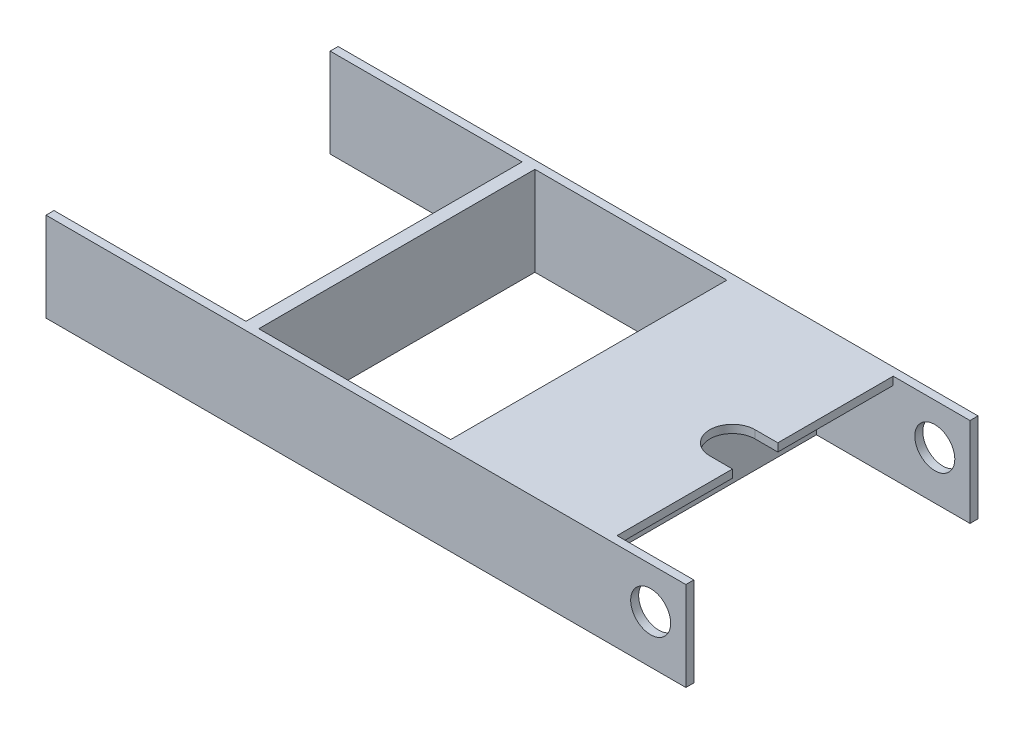
ISO-10303-21;
HEADER;
FILE_DESCRIPTION(('STEP AP214'),'2;1');
FILE_NAME('part.step','',(''),(''),'','','');
FILE_SCHEMA(('AUTOMOTIVE_DESIGN { 1 0 10303 214 1 1 1 1 }'));
ENDSEC;
DATA;
#1=APPLICATION_CONTEXT('core data for automotive mechanical design processes');
#2=APPLICATION_PROTOCOL_DEFINITION('international standard','automotive_design',2000,#1);
#3=PRODUCT_CONTEXT('',#1,'mechanical');
#4=PRODUCT('Part','Part','',(#3));
#5=PRODUCT_RELATED_PRODUCT_CATEGORY('part','',(#4));
#6=PRODUCT_DEFINITION_FORMATION('','',#4);
#7=PRODUCT_DEFINITION_CONTEXT('part definition',#1,'design');
#8=PRODUCT_DEFINITION('design','',#6,#7);
#9=PRODUCT_DEFINITION_SHAPE('','',#8);
#10=(LENGTH_UNIT() NAMED_UNIT(*) SI_UNIT(.MILLI.,.METRE.));
#11=(NAMED_UNIT(*) PLANE_ANGLE_UNIT() SI_UNIT($,.RADIAN.));
#12=(NAMED_UNIT(*) SI_UNIT($,.STERADIAN.) SOLID_ANGLE_UNIT());
#13=UNCERTAINTY_MEASURE_WITH_UNIT(LENGTH_MEASURE(1.E-05),#10,'distance_accuracy_value','');
#14=(GEOMETRIC_REPRESENTATION_CONTEXT(3) GLOBAL_UNCERTAINTY_ASSIGNED_CONTEXT((#13)) GLOBAL_UNIT_ASSIGNED_CONTEXT((#10,
#11,#12)) REPRESENTATION_CONTEXT('',''));
#15=CARTESIAN_POINT('',(0.,0.,0.));
#16=DIRECTION('',(0.,0.,1.));
#17=DIRECTION('',(1.,0.,0.));
#18=AXIS2_PLACEMENT_3D('',#15,#16,#17);
#19=CARTESIAN_POINT('',(0.,17.70126,0.));
#20=DIRECTION('',(0.,-1.,0.));
#21=DIRECTION('',(0.,0.,-1.));
#22=AXIS2_PLACEMENT_3D('',#19,#20,#21);
#23=PLANE('',#22);
#24=DIRECTION('',(-1.,0.,0.));
#25=VECTOR('',#24,1.);
#26=CARTESIAN_POINT('',(0.,17.70126,27.4066));
#27=LINE('',#26,#25);
#28=CARTESIAN_POINT('',(-25.4,17.70126,27.4066));
#29=VERTEX_POINT('',#28);
#30=CARTESIAN_POINT('',(-63.5,17.70126,27.4066));
#31=VERTEX_POINT('',#30);
#32=EDGE_CURVE('E225',#29,#31,#27,.T.);
#33=ORIENTED_EDGE('',*,*,#32,.T.);
#34=DIRECTION('',(0.,0.,1.));
#35=VECTOR('',#34,1.);
#36=CARTESIAN_POINT('',(-63.5,17.70126,-28.9941));
#37=LINE('',#36,#35);
#38=CARTESIAN_POINT('',(-63.5,17.70126,28.9941));
#39=VERTEX_POINT('',#38);
#40=EDGE_CURVE('E322',#31,#39,#37,.T.);
#41=ORIENTED_EDGE('',*,*,#40,.T.);
#42=DIRECTION('',(1.,0.,0.));
#43=VECTOR('',#42,1.);
#44=CARTESIAN_POINT('',(63.5,17.70126,28.9941));
#45=LINE('',#44,#43);
#46=CARTESIAN_POINT('',(63.5,17.70126,28.9941));
#47=VERTEX_POINT('',#46);
#48=EDGE_CURVE('E321',#39,#47,#45,.T.);
#49=ORIENTED_EDGE('',*,*,#48,.T.);
#50=DIRECTION('',(0.,0.,-1.));
#51=VECTOR('',#50,1.);
#52=CARTESIAN_POINT('',(63.5,17.70126,-28.9941));
#53=LINE('',#52,#51);
#54=CARTESIAN_POINT('',(63.5,17.70126,27.4066));
#55=VERTEX_POINT('',#54);
#56=EDGE_CURVE('E325',#47,#55,#53,.T.);
#57=ORIENTED_EDGE('',*,*,#56,.T.);
#58=DIRECTION('',(1.,0.,0.));
#59=VECTOR('',#58,1.);
#60=CARTESIAN_POINT('',(0.,17.70126,27.4066));
#61=LINE('',#60,#59);
#62=CARTESIAN_POINT('',(48.26,17.70126,27.4066));
#63=VERTEX_POINT('',#62);
#64=EDGE_CURVE('E304',#63,#55,#61,.T.);
#65=ORIENTED_EDGE('',*,*,#64,.F.);
#66=DIRECTION('',(0.,0.,1.));
#67=VECTOR('',#66,1.);
#68=CARTESIAN_POINT('',(48.26,17.70126,0.));
#69=LINE('',#68,#67);
#70=CARTESIAN_POINT('',(48.26,17.70126,4.500000017));
#71=VERTEX_POINT('',#70);
#72=EDGE_CURVE('E293',#71,#63,#69,.T.);
#73=ORIENTED_EDGE('',*,*,#72,.F.);
#74=DIRECTION('',(1.,0.,0.));
#75=VECTOR('',#74,1.);
#76=CARTESIAN_POINT('',(0.,17.70126,4.50000001699999));
#77=LINE('',#76,#75);
#78=CARTESIAN_POINT('',(43.759999983,17.70126,4.500000017));
#79=VERTEX_POINT('',#78);
#80=EDGE_CURVE('E249',#79,#71,#77,.T.);
#81=ORIENTED_EDGE('',*,*,#80,.F.);
#82=CARTESIAN_POINT('',(43.759999983,17.70126,0.));
#83=DIRECTION('',(0.,1.,0.));
#84=DIRECTION('',(0.,0.,1.));
#85=AXIS2_PLACEMENT_3D('',#82,#83,#84);
#86=CIRCLE('',#85,4.500000017);
#87=CARTESIAN_POINT('',(43.759999983,17.70126,-4.500000017));
#88=VERTEX_POINT('',#87);
#89=EDGE_CURVE('E240',#88,#79,#86,.T.);
#90=ORIENTED_EDGE('',*,*,#89,.F.);
#91=DIRECTION('',(1.,0.,0.));
#92=VECTOR('',#91,1.);
#93=CARTESIAN_POINT('',(0.,17.70126,-4.50000001699999));
#94=LINE('',#93,#92);
#95=CARTESIAN_POINT('',(48.26,17.70126,-4.500000017));
#96=VERTEX_POINT('',#95);
#97=EDGE_CURVE('E251',#88,#96,#94,.T.);
#98=ORIENTED_EDGE('',*,*,#97,.T.);
#99=CARTESIAN_POINT('',(48.26,17.70126,-27.4066));
#100=VERTEX_POINT('',#99);
#101=EDGE_CURVE('E301',#100,#96,#69,.T.);
#102=ORIENTED_EDGE('',*,*,#101,.F.);
#103=DIRECTION('',(1.,0.,0.));
#104=VECTOR('',#103,1.);
#105=CARTESIAN_POINT('',(0.,17.70126,-27.4066));
#106=LINE('',#105,#104);
#107=CARTESIAN_POINT('',(63.5,17.70126,-27.4066));
#108=VERTEX_POINT('',#107);
#109=EDGE_CURVE('E298',#100,#108,#106,.T.);
#110=ORIENTED_EDGE('',*,*,#109,.T.);
#111=CARTESIAN_POINT('',(63.5,17.70126,-28.9941));
#112=VERTEX_POINT('',#111);
#113=EDGE_CURVE('E324',#108,#112,#53,.T.);
#114=ORIENTED_EDGE('',*,*,#113,.T.);
#115=DIRECTION('',(-1.,0.,0.));
#116=VECTOR('',#115,1.);
#117=CARTESIAN_POINT('',(63.5,17.70126,-28.9941));
#118=LINE('',#117,#116);
#119=CARTESIAN_POINT('',(-63.5,17.70126,-28.9941));
#120=VERTEX_POINT('',#119);
#121=EDGE_CURVE('E328',#112,#120,#118,.T.);
#122=ORIENTED_EDGE('',*,*,#121,.T.);
#123=CARTESIAN_POINT('',(-63.5,17.70126,-27.4066));
#124=VERTEX_POINT('',#123);
#125=EDGE_CURVE('E318',#120,#124,#37,.T.);
#126=ORIENTED_EDGE('',*,*,#125,.T.);
#127=DIRECTION('',(-1.,0.,0.));
#128=VECTOR('',#127,1.);
#129=CARTESIAN_POINT('',(0.,17.70126,-27.4066));
#130=LINE('',#129,#128);
#131=CARTESIAN_POINT('',(-25.4,17.70126,-27.4066));
#132=VERTEX_POINT('',#131);
#133=EDGE_CURVE('E233',#132,#124,#130,.T.);
#134=ORIENTED_EDGE('',*,*,#133,.F.);
#135=DIRECTION('',(0.,0.,1.));
#136=VECTOR('',#135,1.);
#137=CARTESIAN_POINT('',(-25.4,17.70126,0.));
#138=LINE('',#137,#136);
#139=EDGE_CURVE('E218',#132,#29,#138,.T.);
#140=ORIENTED_EDGE('',*,*,#139,.T.);
#141=EDGE_LOOP('',(#33,#41,#49,#57,#65,#73,#81,#90,#98,#102,#110,#114,#122,#126,#134,#140));
#142=FACE_BOUND('',#141,.T.);
#143=DIRECTION('',(0.,0.,1.));
#144=VECTOR('',#143,1.);
#145=CARTESIAN_POINT('',(15.24,17.70126,0.));
#146=LINE('',#145,#144);
#147=CARTESIAN_POINT('',(15.24,17.70126,-27.4066));
#148=VERTEX_POINT('',#147);
#149=CARTESIAN_POINT('',(15.24,17.70126,27.4066));
#150=VERTEX_POINT('',#149);
#151=EDGE_CURVE('E53',#148,#150,#146,.T.);
#152=ORIENTED_EDGE('',*,*,#151,.T.);
#153=DIRECTION('',(1.,0.,0.));
#154=VECTOR('',#153,1.);
#155=CARTESIAN_POINT('',(0.,17.70126,27.4066));
#156=LINE('',#155,#154);
#157=CARTESIAN_POINT('',(-22.86,17.70126,27.4066));
#158=VERTEX_POINT('',#157);
#159=EDGE_CURVE('E203',#158,#150,#156,.T.);
#160=ORIENTED_EDGE('',*,*,#159,.F.);
#161=DIRECTION('',(0.,0.,1.));
#162=VECTOR('',#161,1.);
#163=CARTESIAN_POINT('',(-22.86,17.70126,0.));
#164=LINE('',#163,#162);
#165=CARTESIAN_POINT('',(-22.86,17.70126,-27.4066));
#166=VERTEX_POINT('',#165);
#167=EDGE_CURVE('E206',#166,#158,#164,.T.);
#168=ORIENTED_EDGE('',*,*,#167,.F.);
#169=DIRECTION('',(1.,0.,0.));
#170=VECTOR('',#169,1.);
#171=CARTESIAN_POINT('',(0.,17.70126,-27.4066));
#172=LINE('',#171,#170);
#173=EDGE_CURVE('E212',#166,#148,#172,.T.);
#174=ORIENTED_EDGE('',*,*,#173,.T.);
#175=EDGE_LOOP('',(#152,#160,#168,#174));
#176=FACE_BOUND('',#175,.T.);
#177=ADVANCED_FACE('F38',(#142,#176),#23,.F.);
#178=CARTESIAN_POINT('',(0.,0.,0.));
#179=DIRECTION('',(0.,-1.,0.));
#180=DIRECTION('',(0.,0.,-1.));
#181=AXIS2_PLACEMENT_3D('',#178,#179,#180);
#182=PLANE('',#181);
#183=DIRECTION('',(0.,0.,1.));
#184=VECTOR('',#183,1.);
#185=CARTESIAN_POINT('',(-63.5,0.,-28.9941));
#186=LINE('',#185,#184);
#187=CARTESIAN_POINT('',(-63.5,0.,27.4066));
#188=VERTEX_POINT('',#187);
#189=CARTESIAN_POINT('',(-63.5,0.,28.9941));
#190=VERTEX_POINT('',#189);
#191=EDGE_CURVE('E311',#188,#190,#186,.T.);
#192=ORIENTED_EDGE('',*,*,#191,.F.);
#193=DIRECTION('',(-1.,0.,0.));
#194=VECTOR('',#193,1.);
#195=CARTESIAN_POINT('',(0.,0.,27.4066));
#196=LINE('',#195,#194);
#197=CARTESIAN_POINT('',(-25.4,0.,27.4066));
#198=VERTEX_POINT('',#197);
#199=EDGE_CURVE('E228',#198,#188,#196,.T.);
#200=ORIENTED_EDGE('',*,*,#199,.F.);
#201=DIRECTION('',(0.,0.,1.));
#202=VECTOR('',#201,1.);
#203=CARTESIAN_POINT('',(-25.4,0.,0.));
#204=LINE('',#203,#202);
#205=CARTESIAN_POINT('',(-25.4,0.,-27.4066));
#206=VERTEX_POINT('',#205);
#207=EDGE_CURVE('E222',#206,#198,#204,.T.);
#208=ORIENTED_EDGE('',*,*,#207,.F.);
#209=DIRECTION('',(-1.,0.,0.));
#210=VECTOR('',#209,1.);
#211=CARTESIAN_POINT('',(0.,0.,-27.4066));
#212=LINE('',#211,#210);
#213=CARTESIAN_POINT('',(-63.5,0.,-27.4066));
#214=VERTEX_POINT('',#213);
#215=EDGE_CURVE('E224',#206,#214,#212,.T.);
#216=ORIENTED_EDGE('',*,*,#215,.T.);
#217=CARTESIAN_POINT('',(-63.5,0.,-28.9941));
#218=VERTEX_POINT('',#217);
#219=EDGE_CURVE('E331',#218,#214,#186,.T.);
#220=ORIENTED_EDGE('',*,*,#219,.F.);
#221=DIRECTION('',(-1.,0.,0.));
#222=VECTOR('',#221,1.);
#223=CARTESIAN_POINT('',(63.5,0.,-28.9941));
#224=LINE('',#223,#222);
#225=CARTESIAN_POINT('',(63.5,0.,-28.9941));
#226=VERTEX_POINT('',#225);
#227=EDGE_CURVE('E340',#226,#218,#224,.T.);
#228=ORIENTED_EDGE('',*,*,#227,.F.);
#229=DIRECTION('',(0.,0.,-1.));
#230=VECTOR('',#229,1.);
#231=CARTESIAN_POINT('',(63.5,0.,-28.9941));
#232=LINE('',#231,#230);
#233=CARTESIAN_POINT('',(63.5,0.,-27.4066));
#234=VERTEX_POINT('',#233);
#235=EDGE_CURVE('E336',#234,#226,#232,.T.);
#236=ORIENTED_EDGE('',*,*,#235,.F.);
#237=DIRECTION('',(1.,0.,0.));
#238=VECTOR('',#237,1.);
#239=CARTESIAN_POINT('',(0.,0.,-27.4066));
#240=LINE('',#239,#238);
#241=CARTESIAN_POINT('',(33.02,0.,-27.4066));
#242=VERTEX_POINT('',#241);
#243=EDGE_CURVE('E297',#242,#234,#240,.T.);
#244=ORIENTED_EDGE('',*,*,#243,.F.);
#245=DIRECTION('',(0.,0.,-1.));
#246=VECTOR('',#245,1.);
#247=CARTESIAN_POINT('',(33.02,0.,0.));
#248=LINE('',#247,#246);
#249=CARTESIAN_POINT('',(33.02,0.,27.4066));
#250=VERTEX_POINT('',#249);
#251=EDGE_CURVE('E269',#250,#242,#248,.T.);
#252=ORIENTED_EDGE('',*,*,#251,.F.);
#253=DIRECTION('',(1.,0.,0.));
#254=VECTOR('',#253,1.);
#255=CARTESIAN_POINT('',(0.,0.,27.4066));
#256=LINE('',#255,#254);
#257=CARTESIAN_POINT('',(63.5,0.,27.4066));
#258=VERTEX_POINT('',#257);
#259=EDGE_CURVE('E294',#250,#258,#256,.T.);
#260=ORIENTED_EDGE('',*,*,#259,.T.);
#261=CARTESIAN_POINT('',(63.5,0.,28.9941));
#262=VERTEX_POINT('',#261);
#263=EDGE_CURVE('E337',#262,#258,#232,.T.);
#264=ORIENTED_EDGE('',*,*,#263,.F.);
#265=DIRECTION('',(1.,0.,0.));
#266=VECTOR('',#265,1.);
#267=CARTESIAN_POINT('',(63.5,0.,28.9941));
#268=LINE('',#267,#266);
#269=EDGE_CURVE('E334',#190,#262,#268,.T.);
#270=ORIENTED_EDGE('',*,*,#269,.F.);
#271=EDGE_LOOP('',(#192,#200,#208,#216,#220,#228,#236,#244,#252,#260,#264,#270));
#272=FACE_BOUND('',#271,.T.);
#273=DIRECTION('',(1.,0.,0.));
#274=VECTOR('',#273,1.);
#275=CARTESIAN_POINT('',(0.,0.,27.4066));
#276=LINE('',#275,#274);
#277=CARTESIAN_POINT('',(-22.86,0.,27.4066));
#278=VERTEX_POINT('',#277);
#279=CARTESIAN_POINT('',(15.24,0.,27.4066));
#280=VERTEX_POINT('',#279);
#281=EDGE_CURVE('E198',#278,#280,#276,.T.);
#282=ORIENTED_EDGE('',*,*,#281,.T.);
#283=DIRECTION('',(0.,0.,1.));
#284=VECTOR('',#283,1.);
#285=CARTESIAN_POINT('',(15.24,0.,0.));
#286=LINE('',#285,#284);
#287=CARTESIAN_POINT('',(15.24,0.,-27.4066));
#288=VERTEX_POINT('',#287);
#289=EDGE_CURVE('E194',#288,#280,#286,.T.);
#290=ORIENTED_EDGE('',*,*,#289,.F.);
#291=DIRECTION('',(1.,0.,0.));
#292=VECTOR('',#291,1.);
#293=CARTESIAN_POINT('',(0.,0.,-27.4066));
#294=LINE('',#293,#292);
#295=CARTESIAN_POINT('',(-22.86,0.,-27.4066));
#296=VERTEX_POINT('',#295);
#297=EDGE_CURVE('E186',#296,#288,#294,.T.);
#298=ORIENTED_EDGE('',*,*,#297,.F.);
#299=DIRECTION('',(0.,0.,1.));
#300=VECTOR('',#299,1.);
#301=CARTESIAN_POINT('',(-22.86,0.,0.));
#302=LINE('',#301,#300);
#303=EDGE_CURVE('E61',#296,#278,#302,.T.);
#304=ORIENTED_EDGE('',*,*,#303,.T.);
#305=EDGE_LOOP('',(#282,#290,#298,#304));
#306=FACE_BOUND('',#305,.T.);
#307=ADVANCED_FACE('F201',(#272,#306),#182,.T.);
#308=CARTESIAN_POINT('',(-63.5,17.70126,-28.9941));
#309=DIRECTION('',(1.,0.,0.));
#310=DIRECTION('',(0.,0.,-1.));
#311=AXIS2_PLACEMENT_3D('',#308,#309,#310);
#312=PLANE('',#311);
#313=DIRECTION('',(0.,1.,0.));
#314=VECTOR('',#313,1.);
#315=CARTESIAN_POINT('',(-63.5,0.,27.4066));
#316=LINE('',#315,#314);
#317=EDGE_CURVE('E241',#188,#31,#316,.T.);
#318=ORIENTED_EDGE('',*,*,#317,.F.);
#319=ORIENTED_EDGE('',*,*,#191,.T.);
#320=DIRECTION('',(0.,-1.,0.));
#321=VECTOR('',#320,1.);
#322=CARTESIAN_POINT('',(-63.5,17.70126,28.9941));
#323=LINE('',#322,#321);
#324=EDGE_CURVE('E350',#39,#190,#323,.T.);
#325=ORIENTED_EDGE('',*,*,#324,.F.);
#326=ORIENTED_EDGE('',*,*,#40,.F.);
#327=EDGE_LOOP('',(#318,#319,#325,#326));
#328=FACE_BOUND('',#327,.T.);
#329=ADVANCED_FACE('F413',(#328),#312,.F.);
#330=CARTESIAN_POINT('',(48.26,0.,0.));
#331=DIRECTION('',(-1.,0.,0.));
#332=DIRECTION('',(0.,0.,1.));
#333=AXIS2_PLACEMENT_3D('',#330,#331,#332);
#334=PLANE('',#333);
#335=DIRECTION('',(0.,1.,0.));
#336=VECTOR('',#335,1.);
#337=CARTESIAN_POINT('',(48.26,0.,-4.500000017));
#338=LINE('',#337,#336);
#339=CARTESIAN_POINT('',(48.26,16.11376,-4.500000017));
#340=VERTEX_POINT('',#339);
#341=EDGE_CURVE('E258',#340,#96,#338,.T.);
#342=ORIENTED_EDGE('',*,*,#341,.F.);
#343=DIRECTION('',(0.,0.,-1.));
#344=VECTOR('',#343,1.);
#345=CARTESIAN_POINT('',(48.26,16.11376,0.));
#346=LINE('',#345,#344);
#347=CARTESIAN_POINT('',(48.26,16.11376,-27.4066));
#348=VERTEX_POINT('',#347);
#349=EDGE_CURVE('E279',#340,#348,#346,.T.);
#350=ORIENTED_EDGE('',*,*,#349,.T.);
#351=DIRECTION('',(0.,1.,0.));
#352=VECTOR('',#351,1.);
#353=CARTESIAN_POINT('',(48.26,0.,-27.4066));
#354=LINE('',#353,#352);
#355=EDGE_CURVE('E309',#348,#100,#354,.T.);
#356=ORIENTED_EDGE('',*,*,#355,.T.);
#357=ORIENTED_EDGE('',*,*,#101,.T.);
#358=EDGE_LOOP('',(#342,#350,#356,#357));
#359=FACE_BOUND('',#358,.T.);
#360=ADVANCED_FACE('F411',(#359),#334,.F.);
#361=CARTESIAN_POINT('',(63.5,16.11376,0.));
#362=DIRECTION('',(0.,1.,0.));
#363=DIRECTION('',(0.,0.,1.));
#364=AXIS2_PLACEMENT_3D('',#361,#362,#363);
#365=PLANE('',#364);
#366=DIRECTION('',(1.,0.,0.));
#367=VECTOR('',#366,1.);
#368=CARTESIAN_POINT('',(63.5,16.11376,-4.500000017));
#369=LINE('',#368,#367);
#370=CARTESIAN_POINT('',(43.759999983,16.11376,-4.500000017));
#371=VERTEX_POINT('',#370);
#372=EDGE_CURVE('E11',#371,#340,#369,.T.);
#373=ORIENTED_EDGE('',*,*,#372,.F.);
#374=CARTESIAN_POINT('',(43.759999983,16.11376,0.));
#375=DIRECTION('',(0.,1.,0.));
#376=DIRECTION('',(0.,0.,1.));
#377=AXIS2_PLACEMENT_3D('',#374,#375,#376);
#378=CIRCLE('',#377,4.500000017);
#379=CARTESIAN_POINT('',(43.759999983,16.11376,4.500000017));
#380=VERTEX_POINT('',#379);
#381=EDGE_CURVE('E46',#371,#380,#378,.T.);
#382=ORIENTED_EDGE('',*,*,#381,.T.);
#383=DIRECTION('',(1.,0.,0.));
#384=VECTOR('',#383,1.);
#385=CARTESIAN_POINT('',(63.5,16.11376,4.500000017));
#386=LINE('',#385,#384);
#387=CARTESIAN_POINT('',(48.26,16.11376,4.500000017));
#388=VERTEX_POINT('',#387);
#389=EDGE_CURVE('E353',#380,#388,#386,.T.);
#390=ORIENTED_EDGE('',*,*,#389,.T.);
#391=CARTESIAN_POINT('',(48.26,16.11376,27.4066));
#392=VERTEX_POINT('',#391);
#393=EDGE_CURVE('E280',#392,#388,#346,.T.);
#394=ORIENTED_EDGE('',*,*,#393,.F.);
#395=DIRECTION('',(-1.,0.,0.));
#396=VECTOR('',#395,1.);
#397=CARTESIAN_POINT('',(63.5,16.11376,27.4066));
#398=LINE('',#397,#396);
#399=CARTESIAN_POINT('',(33.02,16.11376,27.4066));
#400=VERTEX_POINT('',#399);
#401=EDGE_CURVE('E277',#392,#400,#398,.T.);
#402=ORIENTED_EDGE('',*,*,#401,.T.);
#403=DIRECTION('',(0.,0.,-1.));
#404=VECTOR('',#403,1.);
#405=CARTESIAN_POINT('',(33.02,16.11376,0.));
#406=LINE('',#405,#404);
#407=CARTESIAN_POINT('',(33.02,16.11376,-27.4066));
#408=VERTEX_POINT('',#407);
#409=EDGE_CURVE('E257',#400,#408,#406,.T.);
#410=ORIENTED_EDGE('',*,*,#409,.T.);
#411=DIRECTION('',(-1.,0.,0.));
#412=VECTOR('',#411,1.);
#413=CARTESIAN_POINT('',(63.5,16.11376,-27.4066));
#414=LINE('',#413,#412);
#415=EDGE_CURVE('E275',#348,#408,#414,.T.);
#416=ORIENTED_EDGE('',*,*,#415,.F.);
#417=ORIENTED_EDGE('',*,*,#349,.F.);
#418=EDGE_LOOP('',(#373,#382,#390,#394,#402,#410,#416,#417));
#419=FACE_BOUND('',#418,.T.);
#420=ADVANCED_FACE('F360',(#419),#365,.F.);
#421=CARTESIAN_POINT('',(63.5,17.70126,-28.9941));
#422=DIRECTION('',(-1.,0.,0.));
#423=DIRECTION('',(0.,0.,1.));
#424=AXIS2_PLACEMENT_3D('',#421,#422,#423);
#425=PLANE('',#424);
#426=DIRECTION('',(0.,1.,0.));
#427=VECTOR('',#426,1.);
#428=CARTESIAN_POINT('',(63.5,0.,-27.4066));
#429=LINE('',#428,#427);
#430=EDGE_CURVE('E312',#234,#108,#429,.T.);
#431=ORIENTED_EDGE('',*,*,#430,.F.);
#432=ORIENTED_EDGE('',*,*,#235,.T.);
#433=DIRECTION('',(0.,-1.,0.));
#434=VECTOR('',#433,1.);
#435=CARTESIAN_POINT('',(63.5,17.70126,-28.9941));
#436=LINE('',#435,#434);
#437=EDGE_CURVE('E344',#112,#226,#436,.T.);
#438=ORIENTED_EDGE('',*,*,#437,.F.);
#439=ORIENTED_EDGE('',*,*,#113,.F.);
#440=EDGE_LOOP('',(#431,#432,#438,#439));
#441=FACE_BOUND('',#440,.T.);
#442=ADVANCED_FACE('F405',(#441),#425,.F.);
#443=ORIENTED_EDGE('',*,*,#219,.T.);
#444=DIRECTION('',(0.,1.,0.));
#445=VECTOR('',#444,1.);
#446=CARTESIAN_POINT('',(-63.5,0.,-27.4066));
#447=LINE('',#446,#445);
#448=EDGE_CURVE('E243',#214,#124,#447,.T.);
#449=ORIENTED_EDGE('',*,*,#448,.T.);
#450=ORIENTED_EDGE('',*,*,#125,.F.);
#451=DIRECTION('',(0.,-1.,0.));
#452=VECTOR('',#451,1.);
#453=CARTESIAN_POINT('',(-63.5,17.70126,-28.9941));
#454=LINE('',#453,#452);
#455=EDGE_CURVE('E330',#120,#218,#454,.T.);
#456=ORIENTED_EDGE('',*,*,#455,.T.);
#457=EDGE_LOOP('',(#443,#449,#450,#456));
#458=FACE_BOUND('',#457,.T.);
#459=ADVANCED_FACE('F40',(#458),#312,.F.);
#460=CARTESIAN_POINT('',(63.5,17.70126,28.9941));
#461=DIRECTION('',(0.,0.,-1.));
#462=DIRECTION('',(-1.,0.,0.));
#463=AXIS2_PLACEMENT_3D('',#460,#461,#462);
#464=PLANE('',#463);
#465=CARTESIAN_POINT('',(56.515,9.54786,28.9941));
#466=DIRECTION('',(0.,0.,1.));
#467=DIRECTION('',(1.,0.,0.));
#468=AXIS2_PLACEMENT_3D('',#465,#466,#467);
#469=CIRCLE('',#468,3.96875);
#470=CARTESIAN_POINT('',(60.48375,9.54786,28.9941));
#471=VERTEX_POINT('',#470);
#472=EDGE_CURVE('E283',#471,#471,#469,.T.);
#473=ORIENTED_EDGE('',*,*,#472,.F.);
#474=EDGE_LOOP('',(#473));
#475=FACE_BOUND('',#474,.T.);
#476=ORIENTED_EDGE('',*,*,#269,.T.);
#477=DIRECTION('',(0.,-1.,0.));
#478=VECTOR('',#477,1.);
#479=CARTESIAN_POINT('',(63.5,17.70126,28.9941));
#480=LINE('',#479,#478);
#481=EDGE_CURVE('E347',#47,#262,#480,.T.);
#482=ORIENTED_EDGE('',*,*,#481,.F.);
#483=ORIENTED_EDGE('',*,*,#48,.F.);
#484=ORIENTED_EDGE('',*,*,#324,.T.);
#485=EDGE_LOOP('',(#476,#482,#483,#484));
#486=FACE_BOUND('',#485,.T.);
#487=ADVANCED_FACE('F437',(#475,#486),#464,.F.);
#488=ORIENTED_EDGE('',*,*,#263,.T.);
#489=DIRECTION('',(0.,1.,0.));
#490=VECTOR('',#489,1.);
#491=CARTESIAN_POINT('',(63.5,0.,27.4066));
#492=LINE('',#491,#490);
#493=EDGE_CURVE('E314',#258,#55,#492,.T.);
#494=ORIENTED_EDGE('',*,*,#493,.T.);
#495=ORIENTED_EDGE('',*,*,#56,.F.);
#496=ORIENTED_EDGE('',*,*,#481,.T.);
#497=EDGE_LOOP('',(#488,#494,#495,#496));
#498=FACE_BOUND('',#497,.T.);
#499=ADVANCED_FACE('F434',(#498),#425,.F.);
#500=CARTESIAN_POINT('',(63.5,17.70126,-28.9941));
#501=DIRECTION('',(0.,0.,1.));
#502=DIRECTION('',(1.,0.,0.));
#503=AXIS2_PLACEMENT_3D('',#500,#501,#502);
#504=PLANE('',#503);
#505=CARTESIAN_POINT('',(56.515,9.54786,-28.9941));
#506=DIRECTION('',(0.,0.,1.));
#507=DIRECTION('',(1.,0.,0.));
#508=AXIS2_PLACEMENT_3D('',#505,#506,#507);
#509=CIRCLE('',#508,3.96875);
#510=CARTESIAN_POINT('',(60.48375,9.54786,-28.9941));
#511=VERTEX_POINT('',#510);
#512=EDGE_CURVE('E286',#511,#511,#509,.T.);
#513=ORIENTED_EDGE('',*,*,#512,.T.);
#514=EDGE_LOOP('',(#513));
#515=FACE_BOUND('',#514,.T.);
#516=ORIENTED_EDGE('',*,*,#227,.T.);
#517=ORIENTED_EDGE('',*,*,#455,.F.);
#518=ORIENTED_EDGE('',*,*,#121,.F.);
#519=ORIENTED_EDGE('',*,*,#437,.T.);
#520=EDGE_LOOP('',(#516,#517,#518,#519));
#521=FACE_BOUND('',#520,.T.);
#522=ADVANCED_FACE('F424',(#515,#521),#504,.F.);
#523=ORIENTED_EDGE('',*,*,#393,.T.);
#524=DIRECTION('',(0.,1.,0.));
#525=VECTOR('',#524,1.);
#526=CARTESIAN_POINT('',(48.26,0.,4.500000017));
#527=LINE('',#526,#525);
#528=EDGE_CURVE('E260',#388,#71,#527,.T.);
#529=ORIENTED_EDGE('',*,*,#528,.T.);
#530=ORIENTED_EDGE('',*,*,#72,.T.);
#531=DIRECTION('',(0.,1.,0.));
#532=VECTOR('',#531,1.);
#533=CARTESIAN_POINT('',(48.26,0.,27.4066));
#534=LINE('',#533,#532);
#535=EDGE_CURVE('E300',#392,#63,#534,.T.);
#536=ORIENTED_EDGE('',*,*,#535,.F.);
#537=EDGE_LOOP('',(#523,#529,#530,#536));
#538=FACE_BOUND('',#537,.T.);
#539=ADVANCED_FACE('F380',(#538),#334,.F.);
#540=CARTESIAN_POINT('',(0.,0.,-27.4066));
#541=DIRECTION('',(0.,0.,1.));
#542=DIRECTION('',(1.,0.,0.));
#543=AXIS2_PLACEMENT_3D('',#540,#541,#542);
#544=PLANE('',#543);
#545=ORIENTED_EDGE('',*,*,#355,.F.);
#546=ORIENTED_EDGE('',*,*,#415,.T.);
#547=DIRECTION('',(0.,1.,0.));
#548=VECTOR('',#547,1.);
#549=CARTESIAN_POINT('',(33.02,0.,-27.4066));
#550=LINE('',#549,#548);
#551=EDGE_CURVE('E272',#242,#408,#550,.T.);
#552=ORIENTED_EDGE('',*,*,#551,.F.);
#553=ORIENTED_EDGE('',*,*,#243,.T.);
#554=ORIENTED_EDGE('',*,*,#430,.T.);
#555=ORIENTED_EDGE('',*,*,#109,.F.);
#556=EDGE_LOOP('',(#545,#546,#552,#553,#554,#555));
#557=FACE_BOUND('',#556,.T.);
#558=CARTESIAN_POINT('',(56.515,9.54786,-27.4066));
#559=DIRECTION('',(0.,0.,1.));
#560=DIRECTION('',(1.,0.,0.));
#561=AXIS2_PLACEMENT_3D('',#558,#559,#560);
#562=CIRCLE('',#561,3.96875);
#563=CARTESIAN_POINT('',(60.48375,9.54786,-27.4066));
#564=VERTEX_POINT('',#563);
#565=EDGE_CURVE('E290',#564,#564,#562,.T.);
#566=ORIENTED_EDGE('',*,*,#565,.F.);
#567=EDGE_LOOP('',(#566));
#568=FACE_BOUND('',#567,.T.);
#569=ADVANCED_FACE('F400',(#557,#568),#544,.T.);
#570=CARTESIAN_POINT('',(0.,0.,27.4066));
#571=DIRECTION('',(0.,0.,1.));
#572=DIRECTION('',(1.,0.,0.));
#573=AXIS2_PLACEMENT_3D('',#570,#571,#572);
#574=PLANE('',#573);
#575=ORIENTED_EDGE('',*,*,#64,.T.);
#576=ORIENTED_EDGE('',*,*,#493,.F.);
#577=ORIENTED_EDGE('',*,*,#259,.F.);
#578=DIRECTION('',(0.,-1.,0.));
#579=VECTOR('',#578,1.);
#580=CARTESIAN_POINT('',(33.02,0.,27.4066));
#581=LINE('',#580,#579);
#582=EDGE_CURVE('E266',#400,#250,#581,.T.);
#583=ORIENTED_EDGE('',*,*,#582,.F.);
#584=ORIENTED_EDGE('',*,*,#401,.F.);
#585=ORIENTED_EDGE('',*,*,#535,.T.);
#586=EDGE_LOOP('',(#575,#576,#577,#583,#584,#585));
#587=FACE_BOUND('',#586,.T.);
#588=CARTESIAN_POINT('',(56.515,9.54786,27.4066));
#589=DIRECTION('',(0.,0.,1.));
#590=DIRECTION('',(1.,0.,0.));
#591=AXIS2_PLACEMENT_3D('',#588,#589,#590);
#592=CIRCLE('',#591,3.96875);
#593=CARTESIAN_POINT('',(60.48375,9.54786,27.4066));
#594=VERTEX_POINT('',#593);
#595=EDGE_CURVE('E289',#594,#594,#592,.T.);
#596=ORIENTED_EDGE('',*,*,#595,.T.);
#597=EDGE_LOOP('',(#596));
#598=FACE_BOUND('',#597,.T.);
#599=ADVANCED_FACE('F386',(#587,#598),#574,.F.);
#600=CARTESIAN_POINT('',(56.515,9.54786,-28.9941));
#601=DIRECTION('',(0.,0.,1.));
#602=DIRECTION('',(1.,0.,0.));
#603=AXIS2_PLACEMENT_3D('',#600,#601,#602);
#604=CYLINDRICAL_SURFACE('',#603,3.96875);
#605=ORIENTED_EDGE('',*,*,#472,.T.);
#606=EDGE_LOOP('',(#605));
#607=FACE_BOUND('',#606,.T.);
#608=ORIENTED_EDGE('',*,*,#595,.F.);
#609=EDGE_LOOP('',(#608));
#610=FACE_BOUND('',#609,.T.);
#611=ADVANCED_FACE('F492',(#607,#610),#604,.F.);
#612=ORIENTED_EDGE('',*,*,#565,.T.);
#613=EDGE_LOOP('',(#612));
#614=FACE_BOUND('',#613,.T.);
#615=ORIENTED_EDGE('',*,*,#512,.F.);
#616=EDGE_LOOP('',(#615));
#617=FACE_BOUND('',#616,.T.);
#618=ADVANCED_FACE('F488',(#614,#617),#604,.F.);
#619=CARTESIAN_POINT('',(33.02,0.,0.));
#620=DIRECTION('',(1.,0.,0.));
#621=DIRECTION('',(0.,0.,-1.));
#622=AXIS2_PLACEMENT_3D('',#619,#620,#621);
#623=PLANE('',#622);
#624=ORIENTED_EDGE('',*,*,#409,.F.);
#625=ORIENTED_EDGE('',*,*,#582,.T.);
#626=ORIENTED_EDGE('',*,*,#251,.T.);
#627=ORIENTED_EDGE('',*,*,#551,.T.);
#628=EDGE_LOOP('',(#624,#625,#626,#627));
#629=FACE_BOUND('',#628,.T.);
#630=ADVANCED_FACE('F390',(#629),#623,.T.);
#631=CARTESIAN_POINT('',(43.759999983,0.,0.));
#632=DIRECTION('',(0.,1.,0.));
#633=DIRECTION('',(0.,0.,1.));
#634=AXIS2_PLACEMENT_3D('',#631,#632,#633);
#635=CYLINDRICAL_SURFACE('',#634,4.500000017);
#636=DIRECTION('',(0.,1.,0.));
#637=VECTOR('',#636,1.);
#638=CARTESIAN_POINT('',(43.759999983,0.,-4.500000017));
#639=LINE('',#638,#637);
#640=EDGE_CURVE('E255',#371,#88,#639,.T.);
#641=ORIENTED_EDGE('',*,*,#640,.T.);
#642=ORIENTED_EDGE('',*,*,#89,.T.);
#643=DIRECTION('',(0.,1.,0.));
#644=VECTOR('',#643,1.);
#645=CARTESIAN_POINT('',(43.759999983,0.,4.500000017));
#646=LINE('',#645,#644);
#647=EDGE_CURVE('E254',#380,#79,#646,.T.);
#648=ORIENTED_EDGE('',*,*,#647,.F.);
#649=ORIENTED_EDGE('',*,*,#381,.F.);
#650=EDGE_LOOP('',(#641,#642,#648,#649));
#651=FACE_BOUND('',#650,.T.);
#652=ADVANCED_FACE('F365',(#651),#635,.F.);
#653=CARTESIAN_POINT('',(0.,0.,-4.50000001699999));
#654=DIRECTION('',(0.,0.,1.));
#655=DIRECTION('',(1.,0.,0.));
#656=AXIS2_PLACEMENT_3D('',#653,#654,#655);
#657=PLANE('',#656);
#658=ORIENTED_EDGE('',*,*,#372,.T.);
#659=ORIENTED_EDGE('',*,*,#341,.T.);
#660=ORIENTED_EDGE('',*,*,#97,.F.);
#661=ORIENTED_EDGE('',*,*,#640,.F.);
#662=EDGE_LOOP('',(#658,#659,#660,#661));
#663=FACE_BOUND('',#662,.T.);
#664=ADVANCED_FACE('F368',(#663),#657,.T.);
#665=CARTESIAN_POINT('',(0.,0.,4.50000001699999));
#666=DIRECTION('',(0.,0.,1.));
#667=DIRECTION('',(1.,0.,0.));
#668=AXIS2_PLACEMENT_3D('',#665,#666,#667);
#669=PLANE('',#668);
#670=ORIENTED_EDGE('',*,*,#647,.T.);
#671=ORIENTED_EDGE('',*,*,#80,.T.);
#672=ORIENTED_EDGE('',*,*,#528,.F.);
#673=ORIENTED_EDGE('',*,*,#389,.F.);
#674=EDGE_LOOP('',(#670,#671,#672,#673));
#675=FACE_BOUND('',#674,.T.);
#676=ADVANCED_FACE('F378',(#675),#669,.F.);
#677=CARTESIAN_POINT('',(-25.4,0.,0.));
#678=DIRECTION('',(-1.,0.,0.));
#679=DIRECTION('',(0.,0.,1.));
#680=AXIS2_PLACEMENT_3D('',#677,#678,#679);
#681=PLANE('',#680);
#682=ORIENTED_EDGE('',*,*,#139,.F.);
#683=DIRECTION('',(0.,1.,0.));
#684=VECTOR('',#683,1.);
#685=CARTESIAN_POINT('',(-25.4,0.,-27.4066));
#686=LINE('',#685,#684);
#687=EDGE_CURVE('E230',#206,#132,#686,.T.);
#688=ORIENTED_EDGE('',*,*,#687,.F.);
#689=ORIENTED_EDGE('',*,*,#207,.T.);
#690=DIRECTION('',(0.,1.,0.));
#691=VECTOR('',#690,1.);
#692=CARTESIAN_POINT('',(-25.4,0.,27.4066));
#693=LINE('',#692,#691);
#694=EDGE_CURVE('E237',#198,#29,#693,.T.);
#695=ORIENTED_EDGE('',*,*,#694,.T.);
#696=EDGE_LOOP('',(#682,#688,#689,#695));
#697=FACE_BOUND('',#696,.T.);
#698=ADVANCED_FACE('F462',(#697),#681,.T.);
#699=CARTESIAN_POINT('',(0.,0.,27.4066));
#700=DIRECTION('',(0.,0.,-1.));
#701=DIRECTION('',(-1.,0.,0.));
#702=AXIS2_PLACEMENT_3D('',#699,#700,#701);
#703=PLANE('',#702);
#704=ORIENTED_EDGE('',*,*,#32,.F.);
#705=ORIENTED_EDGE('',*,*,#694,.F.);
#706=ORIENTED_EDGE('',*,*,#199,.T.);
#707=ORIENTED_EDGE('',*,*,#317,.T.);
#708=EDGE_LOOP('',(#704,#705,#706,#707));
#709=FACE_BOUND('',#708,.T.);
#710=ADVANCED_FACE('F459',(#709),#703,.T.);
#711=CARTESIAN_POINT('',(0.,0.,-27.4066));
#712=DIRECTION('',(0.,0.,-1.));
#713=DIRECTION('',(-1.,0.,0.));
#714=AXIS2_PLACEMENT_3D('',#711,#712,#713);
#715=PLANE('',#714);
#716=ORIENTED_EDGE('',*,*,#133,.T.);
#717=ORIENTED_EDGE('',*,*,#448,.F.);
#718=ORIENTED_EDGE('',*,*,#215,.F.);
#719=ORIENTED_EDGE('',*,*,#687,.T.);
#720=EDGE_LOOP('',(#716,#717,#718,#719));
#721=FACE_BOUND('',#720,.T.);
#722=ADVANCED_FACE('F466',(#721),#715,.F.);
#723=CARTESIAN_POINT('',(15.24,0.,0.));
#724=DIRECTION('',(-1.,0.,0.));
#725=DIRECTION('',(0.,0.,1.));
#726=AXIS2_PLACEMENT_3D('',#723,#724,#725);
#727=PLANE('',#726);
#728=ORIENTED_EDGE('',*,*,#151,.F.);
#729=DIRECTION('',(0.,1.,0.));
#730=VECTOR('',#729,1.);
#731=CARTESIAN_POINT('',(15.24,0.,-27.4066));
#732=LINE('',#731,#730);
#733=EDGE_CURVE('E189',#288,#148,#732,.T.);
#734=ORIENTED_EDGE('',*,*,#733,.F.);
#735=ORIENTED_EDGE('',*,*,#289,.T.);
#736=DIRECTION('',(0.,1.,0.));
#737=VECTOR('',#736,1.);
#738=CARTESIAN_POINT('',(15.24,0.,27.4066));
#739=LINE('',#738,#737);
#740=EDGE_CURVE('E216',#280,#150,#739,.T.);
#741=ORIENTED_EDGE('',*,*,#740,.T.);
#742=EDGE_LOOP('',(#728,#734,#735,#741));
#743=FACE_BOUND('',#742,.T.);
#744=ADVANCED_FACE('F196',(#743),#727,.T.);
#745=CARTESIAN_POINT('',(0.,0.,27.4066));
#746=DIRECTION('',(0.,0.,1.));
#747=DIRECTION('',(1.,0.,0.));
#748=AXIS2_PLACEMENT_3D('',#745,#746,#747);
#749=PLANE('',#748);
#750=ORIENTED_EDGE('',*,*,#159,.T.);
#751=ORIENTED_EDGE('',*,*,#740,.F.);
#752=ORIENTED_EDGE('',*,*,#281,.F.);
#753=DIRECTION('',(0.,1.,0.));
#754=VECTOR('',#753,1.);
#755=CARTESIAN_POINT('',(-22.86,0.,27.4066));
#756=LINE('',#755,#754);
#757=EDGE_CURVE('E219',#278,#158,#756,.T.);
#758=ORIENTED_EDGE('',*,*,#757,.T.);
#759=EDGE_LOOP('',(#750,#751,#752,#758));
#760=FACE_BOUND('',#759,.T.);
#761=ADVANCED_FACE('F475',(#760),#749,.F.);
#762=CARTESIAN_POINT('',(-22.86,0.,0.));
#763=DIRECTION('',(-1.,0.,0.));
#764=DIRECTION('',(0.,0.,1.));
#765=AXIS2_PLACEMENT_3D('',#762,#763,#764);
#766=PLANE('',#765);
#767=ORIENTED_EDGE('',*,*,#167,.T.);
#768=ORIENTED_EDGE('',*,*,#757,.F.);
#769=ORIENTED_EDGE('',*,*,#303,.F.);
#770=DIRECTION('',(0.,1.,0.));
#771=VECTOR('',#770,1.);
#772=CARTESIAN_POINT('',(-22.86,0.,-27.4066));
#773=LINE('',#772,#771);
#774=EDGE_CURVE('E191',#296,#166,#773,.T.);
#775=ORIENTED_EDGE('',*,*,#774,.T.);
#776=EDGE_LOOP('',(#767,#768,#769,#775));
#777=FACE_BOUND('',#776,.T.);
#778=ADVANCED_FACE('F580',(#777),#766,.F.);
#779=CARTESIAN_POINT('',(0.,0.,-27.4066));
#780=DIRECTION('',(0.,0.,1.));
#781=DIRECTION('',(1.,0.,0.));
#782=AXIS2_PLACEMENT_3D('',#779,#780,#781);
#783=PLANE('',#782);
#784=ORIENTED_EDGE('',*,*,#173,.F.);
#785=ORIENTED_EDGE('',*,*,#774,.F.);
#786=ORIENTED_EDGE('',*,*,#297,.T.);
#787=ORIENTED_EDGE('',*,*,#733,.T.);
#788=EDGE_LOOP('',(#784,#785,#786,#787));
#789=FACE_BOUND('',#788,.T.);
#790=ADVANCED_FACE('F188',(#789),#783,.T.);
#791=CLOSED_SHELL('',(#177,#307,#329,#360,#420,#442,#459,#487,#499,#522,#539,#569,#599,#611,
#618,#630,#652,#664,#676,#698,#710,#722,#744,#761,#778,#790));
#792=MANIFOLD_SOLID_BREP('B2',#791);
#793=ADVANCED_BREP_SHAPE_REPRESENTATION('',(#18,#792),#14);
#794=SHAPE_DEFINITION_REPRESENTATION(#9,#793);
ENDSEC;
END-ISO-10303-21;
